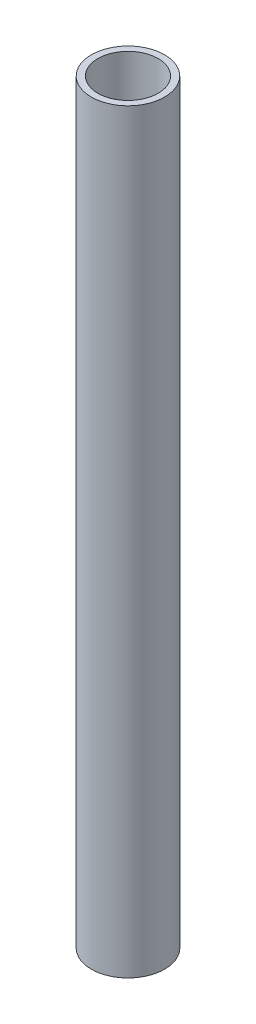
ISO-10303-21;
HEADER;
FILE_DESCRIPTION(('STEP AP214'),'2;1');
FILE_NAME('part.step','',(''),(''),'','','');
FILE_SCHEMA(('AUTOMOTIVE_DESIGN { 1 0 10303 214 1 1 1 1 }'));
ENDSEC;
DATA;
#1=APPLICATION_CONTEXT('core data for automotive mechanical design processes');
#2=APPLICATION_PROTOCOL_DEFINITION('international standard','automotive_design',2000,#1);
#3=PRODUCT_CONTEXT('',#1,'mechanical');
#4=PRODUCT('Part','Part','',(#3));
#5=PRODUCT_RELATED_PRODUCT_CATEGORY('part','',(#4));
#6=PRODUCT_DEFINITION_FORMATION('','',#4);
#7=PRODUCT_DEFINITION_CONTEXT('part definition',#1,'design');
#8=PRODUCT_DEFINITION('design','',#6,#7);
#9=PRODUCT_DEFINITION_SHAPE('','',#8);
#10=(LENGTH_UNIT() NAMED_UNIT(*) SI_UNIT(.MILLI.,.METRE.));
#11=(NAMED_UNIT(*) PLANE_ANGLE_UNIT() SI_UNIT($,.RADIAN.));
#12=(NAMED_UNIT(*) SI_UNIT($,.STERADIAN.) SOLID_ANGLE_UNIT());
#13=UNCERTAINTY_MEASURE_WITH_UNIT(LENGTH_MEASURE(1.E-05),#10,'distance_accuracy_value','');
#14=(GEOMETRIC_REPRESENTATION_CONTEXT(3) GLOBAL_UNCERTAINTY_ASSIGNED_CONTEXT((#13)) GLOBAL_UNIT_ASSIGNED_CONTEXT((#10,
#11,#12)) REPRESENTATION_CONTEXT('',''));
#15=CARTESIAN_POINT('',(0.,0.,0.));
#16=DIRECTION('',(0.,0.,1.));
#17=DIRECTION('',(1.,0.,0.));
#18=AXIS2_PLACEMENT_3D('',#15,#16,#17);
#19=CARTESIAN_POINT('',(0.,199.,0.));
#20=DIRECTION('',(0.,1.,0.));
#21=DIRECTION('',(0.,0.,1.));
#22=AXIS2_PLACEMENT_3D('',#19,#20,#21);
#23=PLANE('',#22);
#24=CARTESIAN_POINT('',(0.,199.,0.));
#25=DIRECTION('',(0.,1.,0.));
#26=DIRECTION('',(0.,0.,1.));
#27=AXIS2_PLACEMENT_3D('',#24,#25,#26);
#28=CIRCLE('',#27,9.652);
#29=CARTESIAN_POINT('',(0.,199.,9.652));
#30=VERTEX_POINT('',#29);
#31=EDGE_CURVE('E10',#30,#30,#28,.T.);
#32=ORIENTED_EDGE('',*,*,#31,.T.);
#33=EDGE_LOOP('',(#32));
#34=FACE_BOUND('',#33,.T.);
#35=CARTESIAN_POINT('',(0.,199.,0.));
#36=DIRECTION('',(0.,1.,0.));
#37=DIRECTION('',(0.,0.,1.));
#38=AXIS2_PLACEMENT_3D('',#35,#36,#37);
#39=CIRCLE('',#38,7.9375);
#40=CARTESIAN_POINT('',(0.,199.,7.9375));
#41=VERTEX_POINT('',#40);
#42=EDGE_CURVE('E41',#41,#41,#39,.T.);
#43=ORIENTED_EDGE('',*,*,#42,.F.);
#44=EDGE_LOOP('',(#43));
#45=FACE_BOUND('',#44,.T.);
#46=ADVANCED_FACE('F30',(#34,#45),#23,.T.);
#47=CARTESIAN_POINT('',(0.,0.,0.));
#48=DIRECTION('',(0.,1.,0.));
#49=DIRECTION('',(0.,0.,1.));
#50=AXIS2_PLACEMENT_3D('',#47,#48,#49);
#51=PLANE('',#50);
#52=CARTESIAN_POINT('',(0.,0.,0.));
#53=DIRECTION('',(0.,1.,0.));
#54=DIRECTION('',(0.,0.,1.));
#55=AXIS2_PLACEMENT_3D('',#52,#53,#54);
#56=CIRCLE('',#55,9.652);
#57=CARTESIAN_POINT('',(0.,0.,9.652));
#58=VERTEX_POINT('',#57);
#59=EDGE_CURVE('E34',#58,#58,#56,.T.);
#60=ORIENTED_EDGE('',*,*,#59,.F.);
#61=EDGE_LOOP('',(#60));
#62=FACE_BOUND('',#61,.T.);
#63=CARTESIAN_POINT('',(0.,0.,0.));
#64=DIRECTION('',(0.,1.,0.));
#65=DIRECTION('',(0.,0.,1.));
#66=AXIS2_PLACEMENT_3D('',#63,#64,#65);
#67=CIRCLE('',#66,7.9375);
#68=CARTESIAN_POINT('',(0.,0.,7.9375));
#69=VERTEX_POINT('',#68);
#70=EDGE_CURVE('E43',#69,#69,#67,.T.);
#71=ORIENTED_EDGE('',*,*,#70,.T.);
#72=EDGE_LOOP('',(#71));
#73=FACE_BOUND('',#72,.T.);
#74=ADVANCED_FACE('F53',(#62,#73),#51,.F.);
#75=CARTESIAN_POINT('',(0.,199.,0.));
#76=DIRECTION('',(0.,-1.,0.));
#77=DIRECTION('',(0.,0.,-1.));
#78=AXIS2_PLACEMENT_3D('',#75,#76,#77);
#79=CYLINDRICAL_SURFACE('',#78,9.652);
#80=ORIENTED_EDGE('',*,*,#31,.F.);
#81=EDGE_LOOP('',(#80));
#82=FACE_BOUND('',#81,.T.);
#83=ORIENTED_EDGE('',*,*,#59,.T.);
#84=EDGE_LOOP('',(#83));
#85=FACE_BOUND('',#84,.T.);
#86=ADVANCED_FACE('F32',(#82,#85),#79,.T.);
#87=CARTESIAN_POINT('',(0.,199.,0.));
#88=DIRECTION('',(0.,-1.,0.));
#89=DIRECTION('',(0.,0.,-1.));
#90=AXIS2_PLACEMENT_3D('',#87,#88,#89);
#91=CYLINDRICAL_SURFACE('',#90,7.9375);
#92=ORIENTED_EDGE('',*,*,#42,.T.);
#93=EDGE_LOOP('',(#92));
#94=FACE_BOUND('',#93,.T.);
#95=ORIENTED_EDGE('',*,*,#70,.F.);
#96=EDGE_LOOP('',(#95));
#97=FACE_BOUND('',#96,.T.);
#98=ADVANCED_FACE('F49',(#94,#97),#91,.F.);
#99=CLOSED_SHELL('',(#46,#74,#86,#98));
#100=MANIFOLD_SOLID_BREP('B2',#99);
#101=ADVANCED_BREP_SHAPE_REPRESENTATION('',(#18,#100),#14);
#102=SHAPE_DEFINITION_REPRESENTATION(#9,#101);
ENDSEC;
END-ISO-10303-21;
